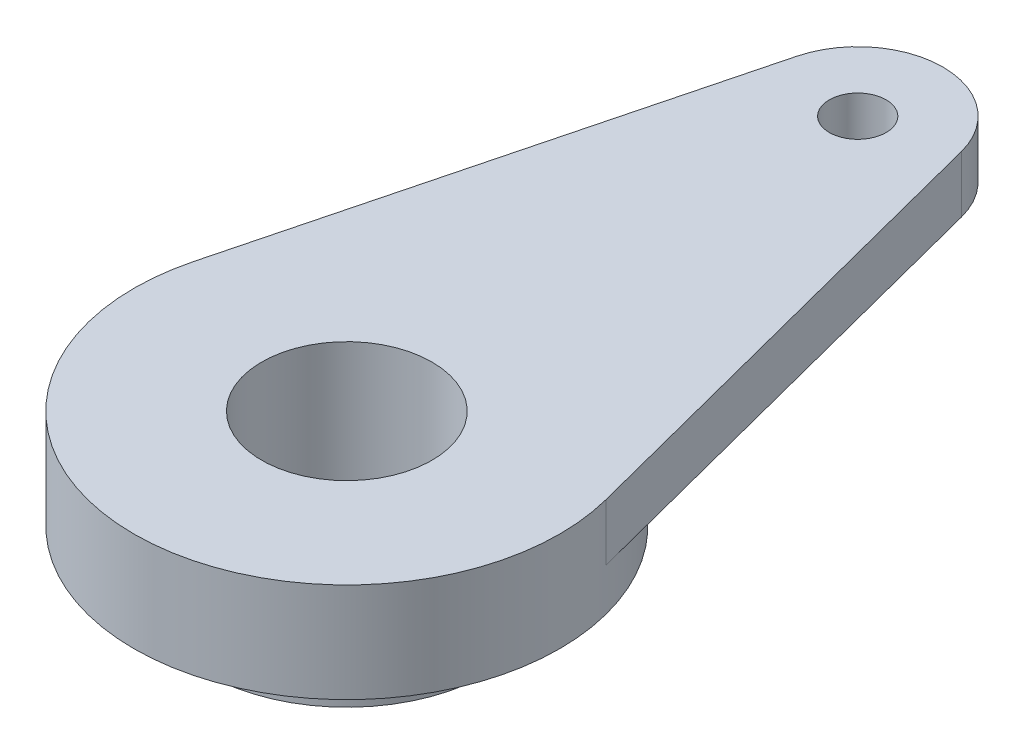
ISO-10303-21;
HEADER;
FILE_DESCRIPTION(('STEP AP214'),'2;1');
FILE_NAME('part.step','',(''),(''),'','','');
FILE_SCHEMA(('AUTOMOTIVE_DESIGN { 1 0 10303 214 1 1 1 1 }'));
ENDSEC;
DATA;
#1=APPLICATION_CONTEXT('core data for automotive mechanical design processes');
#2=APPLICATION_PROTOCOL_DEFINITION('international standard','automotive_design',2000,#1);
#3=PRODUCT_CONTEXT('',#1,'mechanical');
#4=PRODUCT('Part','Part','',(#3));
#5=PRODUCT_RELATED_PRODUCT_CATEGORY('part','',(#4));
#6=PRODUCT_DEFINITION_FORMATION('','',#4);
#7=PRODUCT_DEFINITION_CONTEXT('part definition',#1,'design');
#8=PRODUCT_DEFINITION('design','',#6,#7);
#9=PRODUCT_DEFINITION_SHAPE('','',#8);
#10=(LENGTH_UNIT() NAMED_UNIT(*) SI_UNIT(.MILLI.,.METRE.));
#11=(NAMED_UNIT(*) PLANE_ANGLE_UNIT() SI_UNIT($,.RADIAN.));
#12=(NAMED_UNIT(*) SI_UNIT($,.STERADIAN.) SOLID_ANGLE_UNIT());
#13=UNCERTAINTY_MEASURE_WITH_UNIT(LENGTH_MEASURE(1.E-05),#10,'distance_accuracy_value','');
#14=(GEOMETRIC_REPRESENTATION_CONTEXT(3) GLOBAL_UNCERTAINTY_ASSIGNED_CONTEXT((#13)) GLOBAL_UNIT_ASSIGNED_CONTEXT((#10,
#11,#12)) REPRESENTATION_CONTEXT('',''));
#15=CARTESIAN_POINT('',(0.,0.,0.));
#16=DIRECTION('',(0.,0.,1.));
#17=DIRECTION('',(1.,0.,0.));
#18=AXIS2_PLACEMENT_3D('',#15,#16,#17);
#19=CARTESIAN_POINT('',(0.,2.,0.));
#20=DIRECTION('',(0.,-1.,0.));
#21=DIRECTION('',(0.,0.,-1.));
#22=AXIS2_PLACEMENT_3D('',#19,#20,#21);
#23=CYLINDRICAL_SURFACE('',#22,5.);
#24=CARTESIAN_POINT('',(0.,2.,0.));
#25=DIRECTION('',(0.,1.,0.));
#26=DIRECTION('',(0.,0.,1.));
#27=AXIS2_PLACEMENT_3D('',#24,#25,#26);
#28=CIRCLE('',#27,5.);
#29=CARTESIAN_POINT('',(0.,2.,5.));
#30=VERTEX_POINT('',#29);
#31=EDGE_CURVE('E11',#30,#30,#28,.T.);
#32=ORIENTED_EDGE('',*,*,#31,.F.);
#33=EDGE_LOOP('',(#32));
#34=FACE_BOUND('',#33,.T.);
#35=CARTESIAN_POINT('',(0.,0.,0.));
#36=DIRECTION('',(0.,1.,0.));
#37=DIRECTION('',(0.,0.,1.));
#38=AXIS2_PLACEMENT_3D('',#35,#36,#37);
#39=CIRCLE('',#38,5.);
#40=CARTESIAN_POINT('',(0.,0.,5.));
#41=VERTEX_POINT('',#40);
#42=EDGE_CURVE('E37',#41,#41,#39,.T.);
#43=ORIENTED_EDGE('',*,*,#42,.T.);
#44=EDGE_LOOP('',(#43));
#45=FACE_BOUND('',#44,.T.);
#46=ADVANCED_FACE('F34',(#34,#45),#23,.T.);
#47=CARTESIAN_POINT('',(0.,0.,0.));
#48=DIRECTION('',(0.,1.,0.));
#49=DIRECTION('',(0.,0.,1.));
#50=AXIS2_PLACEMENT_3D('',#47,#48,#49);
#51=PLANE('',#50);
#52=CARTESIAN_POINT('',(0.,0.,0.));
#53=DIRECTION('',(0.,-1.,0.));
#54=DIRECTION('',(0.,0.,-1.));
#55=AXIS2_PLACEMENT_3D('',#52,#53,#54);
#56=CIRCLE('',#55,3.);
#57=CARTESIAN_POINT('',(0.,0.,-3.));
#58=VERTEX_POINT('',#57);
#59=EDGE_CURVE('E147',#58,#58,#56,.T.);
#60=ORIENTED_EDGE('',*,*,#59,.F.);
#61=EDGE_LOOP('',(#60));
#62=FACE_BOUND('',#61,.T.);
#63=ORIENTED_EDGE('',*,*,#42,.F.);
#64=EDGE_LOOP('',(#63));
#65=FACE_BOUND('',#64,.T.);
#66=ADVANCED_FACE('F129',(#62,#65),#51,.F.);
#67=CARTESIAN_POINT('',(0.,3.5,0.));
#68=DIRECTION('',(0.,-1.,0.));
#69=DIRECTION('',(0.,0.,-1.));
#70=AXIS2_PLACEMENT_3D('',#67,#68,#69);
#71=CYLINDRICAL_SURFACE('',#70,7.5);
#72=CARTESIAN_POINT('',(0.,3.5,0.));
#73=DIRECTION('',(0.,1.,0.));
#74=DIRECTION('',(0.,0.,1.));
#75=AXIS2_PLACEMENT_3D('',#72,#73,#74);
#76=CIRCLE('',#75,7.5);
#77=CARTESIAN_POINT('',(7.26184377413891,3.5,-1.87500000000001));
#78=VERTEX_POINT('',#77);
#79=CARTESIAN_POINT('',(-7.26184377413891,3.5,-1.875));
#80=VERTEX_POINT('',#79);
#81=EDGE_CURVE('E48',#78,#80,#76,.T.);
#82=ORIENTED_EDGE('',*,*,#81,.F.);
#83=DIRECTION('',(0.,-1.,0.));
#84=VECTOR('',#83,1.);
#85=CARTESIAN_POINT('',(7.26184377413891,5.5,-1.87500000000001));
#86=LINE('',#85,#84);
#87=CARTESIAN_POINT('',(7.26184377413891,5.5,-1.87500000000001));
#88=VERTEX_POINT('',#87);
#89=EDGE_CURVE('E95',#88,#78,#86,.T.);
#90=ORIENTED_EDGE('',*,*,#89,.F.);
#91=CARTESIAN_POINT('',(0.,5.5,0.));
#92=DIRECTION('',(0.,1.,0.));
#93=DIRECTION('',(0.,0.,1.));
#94=AXIS2_PLACEMENT_3D('',#91,#92,#93);
#95=CIRCLE('',#94,7.5);
#96=CARTESIAN_POINT('',(-7.26184377413891,5.5,-1.875));
#97=VERTEX_POINT('',#96);
#98=EDGE_CURVE('E83',#97,#88,#95,.T.);
#99=ORIENTED_EDGE('',*,*,#98,.F.);
#100=DIRECTION('',(0.,-1.,0.));
#101=VECTOR('',#100,1.);
#102=CARTESIAN_POINT('',(-7.26184377413891,5.5,-1.875));
#103=LINE('',#102,#101);
#104=EDGE_CURVE('E90',#97,#80,#103,.T.);
#105=ORIENTED_EDGE('',*,*,#104,.T.);
#106=EDGE_LOOP('',(#82,#90,#99,#105));
#107=FACE_BOUND('',#106,.T.);
#108=CARTESIAN_POINT('',(0.,2.,0.));
#109=DIRECTION('',(0.,1.,0.));
#110=DIRECTION('',(0.,0.,1.));
#111=AXIS2_PLACEMENT_3D('',#108,#109,#110);
#112=CIRCLE('',#111,7.5);
#113=CARTESIAN_POINT('',(0.,2.,7.5));
#114=VERTEX_POINT('',#113);
#115=EDGE_CURVE('E113',#114,#114,#112,.T.);
#116=ORIENTED_EDGE('',*,*,#115,.T.);
#117=EDGE_LOOP('',(#116));
#118=FACE_BOUND('',#117,.T.);
#119=ADVANCED_FACE('F97',(#107,#118),#71,.T.);
#120=CARTESIAN_POINT('',(0.,2.,0.));
#121=DIRECTION('',(0.,1.,0.));
#122=DIRECTION('',(0.,0.,1.));
#123=AXIS2_PLACEMENT_3D('',#120,#121,#122);
#124=PLANE('',#123);
#125=ORIENTED_EDGE('',*,*,#31,.T.);
#126=EDGE_LOOP('',(#125));
#127=FACE_BOUND('',#126,.T.);
#128=ORIENTED_EDGE('',*,*,#115,.F.);
#129=EDGE_LOOP('',(#128));
#130=FACE_BOUND('',#129,.T.);
#131=ADVANCED_FACE('F118',(#127,#130),#124,.F.);
#132=CARTESIAN_POINT('',(0.,3.5,-18.));
#133=DIRECTION('',(0.,1.,0.));
#134=DIRECTION('',(0.,0.,1.));
#135=AXIS2_PLACEMENT_3D('',#132,#133,#134);
#136=PLANE('',#135);
#137=CARTESIAN_POINT('',(0.,3.5,-18.));
#138=DIRECTION('',(0.,1.,0.));
#139=DIRECTION('',(0.,0.,1.));
#140=AXIS2_PLACEMENT_3D('',#137,#138,#139);
#141=CIRCLE('',#140,1.);
#142=CARTESIAN_POINT('',(0.,3.5,-17.));
#143=VERTEX_POINT('',#142);
#144=EDGE_CURVE('E152',#143,#143,#141,.T.);
#145=ORIENTED_EDGE('',*,*,#144,.T.);
#146=EDGE_LOOP('',(#145));
#147=FACE_BOUND('',#146,.T.);
#148=DIRECTION('',(-0.25,0.,-0.968245836551854));
#149=VECTOR('',#148,1.);
#150=CARTESIAN_POINT('',(2.90473750965556,3.5,-18.75));
#151=LINE('',#150,#149);
#152=CARTESIAN_POINT('',(2.90473750965556,3.5,-18.75));
#153=VERTEX_POINT('',#152);
#154=EDGE_CURVE('E71',#78,#153,#151,.T.);
#155=ORIENTED_EDGE('',*,*,#154,.F.);
#156=ORIENTED_EDGE('',*,*,#81,.T.);
#157=DIRECTION('',(-0.25,0.,0.968245836551854));
#158=VECTOR('',#157,1.);
#159=CARTESIAN_POINT('',(-2.90473750965556,3.5,-18.75));
#160=LINE('',#159,#158);
#161=CARTESIAN_POINT('',(-2.90473750965556,3.5,-18.75));
#162=VERTEX_POINT('',#161);
#163=EDGE_CURVE('E92',#162,#80,#160,.T.);
#164=ORIENTED_EDGE('',*,*,#163,.F.);
#165=CARTESIAN_POINT('',(0.,3.5,-18.));
#166=DIRECTION('',(0.,1.,0.));
#167=DIRECTION('',(0.,0.,1.));
#168=AXIS2_PLACEMENT_3D('',#165,#166,#167);
#169=CIRCLE('',#168,3.);
#170=EDGE_CURVE('E104',#153,#162,#169,.T.);
#171=ORIENTED_EDGE('',*,*,#170,.F.);
#172=EDGE_LOOP('',(#155,#156,#164,#171));
#173=FACE_BOUND('',#172,.T.);
#174=ADVANCED_FACE('F120',(#147,#173),#136,.F.);
#175=CARTESIAN_POINT('',(0.,5.5,-18.));
#176=DIRECTION('',(0.,1.,0.));
#177=DIRECTION('',(0.,0.,1.));
#178=AXIS2_PLACEMENT_3D('',#175,#176,#177);
#179=PLANE('',#178);
#180=CARTESIAN_POINT('',(0.,5.5,0.));
#181=DIRECTION('',(0.,-1.,0.));
#182=DIRECTION('',(0.,0.,-1.));
#183=AXIS2_PLACEMENT_3D('',#180,#181,#182);
#184=CIRCLE('',#183,3.);
#185=CARTESIAN_POINT('',(0.,5.5,-3.));
#186=VERTEX_POINT('',#185);
#187=EDGE_CURVE('E149',#186,#186,#184,.T.);
#188=ORIENTED_EDGE('',*,*,#187,.T.);
#189=EDGE_LOOP('',(#188));
#190=FACE_BOUND('',#189,.T.);
#191=CARTESIAN_POINT('',(0.,5.5,-18.));
#192=DIRECTION('',(0.,1.,0.));
#193=DIRECTION('',(0.,0.,1.));
#194=AXIS2_PLACEMENT_3D('',#191,#192,#193);
#195=CIRCLE('',#194,3.);
#196=CARTESIAN_POINT('',(2.90473750965556,5.5,-18.75));
#197=VERTEX_POINT('',#196);
#198=CARTESIAN_POINT('',(-2.90473750965556,5.5,-18.75));
#199=VERTEX_POINT('',#198);
#200=EDGE_CURVE('E86',#197,#199,#195,.T.);
#201=ORIENTED_EDGE('',*,*,#200,.T.);
#202=DIRECTION('',(-0.25,0.,0.968245836551854));
#203=VECTOR('',#202,1.);
#204=CARTESIAN_POINT('',(-2.90473750965556,5.5,-18.75));
#205=LINE('',#204,#203);
#206=EDGE_CURVE('E79',#199,#97,#205,.T.);
#207=ORIENTED_EDGE('',*,*,#206,.T.);
#208=ORIENTED_EDGE('',*,*,#98,.T.);
#209=DIRECTION('',(-0.25,0.,-0.968245836551854));
#210=VECTOR('',#209,1.);
#211=CARTESIAN_POINT('',(2.90473750965556,5.5,-18.75));
#212=LINE('',#211,#210);
#213=EDGE_CURVE('E57',#88,#197,#212,.T.);
#214=ORIENTED_EDGE('',*,*,#213,.T.);
#215=EDGE_LOOP('',(#201,#207,#208,#214));
#216=FACE_BOUND('',#215,.T.);
#217=CARTESIAN_POINT('',(0.,5.5,-18.));
#218=DIRECTION('',(0.,1.,0.));
#219=DIRECTION('',(0.,0.,1.));
#220=AXIS2_PLACEMENT_3D('',#217,#218,#219);
#221=CIRCLE('',#220,1.);
#222=CARTESIAN_POINT('',(0.,5.5,-17.));
#223=VERTEX_POINT('',#222);
#224=EDGE_CURVE('E107',#223,#223,#221,.T.);
#225=ORIENTED_EDGE('',*,*,#224,.F.);
#226=EDGE_LOOP('',(#225));
#227=FACE_BOUND('',#226,.T.);
#228=ADVANCED_FACE('F80',(#190,#216,#227),#179,.T.);
#229=CARTESIAN_POINT('',(0.,5.5,-18.));
#230=DIRECTION('',(0.,-1.,0.));
#231=DIRECTION('',(0.,0.,-1.));
#232=AXIS2_PLACEMENT_3D('',#229,#230,#231);
#233=CYLINDRICAL_SURFACE('',#232,3.);
#234=ORIENTED_EDGE('',*,*,#170,.T.);
#235=DIRECTION('',(0.,-1.,0.));
#236=VECTOR('',#235,1.);
#237=CARTESIAN_POINT('',(-2.90473750965556,5.5,-18.75));
#238=LINE('',#237,#236);
#239=EDGE_CURVE('E94',#199,#162,#238,.T.);
#240=ORIENTED_EDGE('',*,*,#239,.F.);
#241=ORIENTED_EDGE('',*,*,#200,.F.);
#242=DIRECTION('',(0.,-1.,0.));
#243=VECTOR('',#242,1.);
#244=CARTESIAN_POINT('',(2.90473750965556,5.5,-18.75));
#245=LINE('',#244,#243);
#246=EDGE_CURVE('E100',#197,#153,#245,.T.);
#247=ORIENTED_EDGE('',*,*,#246,.T.);
#248=EDGE_LOOP('',(#234,#240,#241,#247));
#249=FACE_BOUND('',#248,.T.);
#250=ADVANCED_FACE('F175',(#249),#233,.T.);
#251=CARTESIAN_POINT('',(-2.90473750965556,5.5,-18.75));
#252=DIRECTION('',(0.968245836551854,0.,0.25));
#253=DIRECTION('',(0.25,0.,-0.968245836551854));
#254=AXIS2_PLACEMENT_3D('',#251,#252,#253);
#255=PLANE('',#254);
#256=ORIENTED_EDGE('',*,*,#163,.T.);
#257=ORIENTED_EDGE('',*,*,#104,.F.);
#258=ORIENTED_EDGE('',*,*,#206,.F.);
#259=ORIENTED_EDGE('',*,*,#239,.T.);
#260=EDGE_LOOP('',(#256,#257,#258,#259));
#261=FACE_BOUND('',#260,.T.);
#262=ADVANCED_FACE('F91',(#261),#255,.F.);
#263=CARTESIAN_POINT('',(2.90473750965556,5.5,-18.75));
#264=DIRECTION('',(-0.968245836551854,0.,0.25));
#265=DIRECTION('',(0.25,0.,0.968245836551854));
#266=AXIS2_PLACEMENT_3D('',#263,#264,#265);
#267=PLANE('',#266);
#268=ORIENTED_EDGE('',*,*,#154,.T.);
#269=ORIENTED_EDGE('',*,*,#246,.F.);
#270=ORIENTED_EDGE('',*,*,#213,.F.);
#271=ORIENTED_EDGE('',*,*,#89,.T.);
#272=EDGE_LOOP('',(#268,#269,#270,#271));
#273=FACE_BOUND('',#272,.T.);
#274=ADVANCED_FACE('F163',(#273),#267,.F.);
#275=CARTESIAN_POINT('',(0.,5.5,-18.));
#276=DIRECTION('',(0.,-1.,0.));
#277=DIRECTION('',(0.,0.,-1.));
#278=AXIS2_PLACEMENT_3D('',#275,#276,#277);
#279=CYLINDRICAL_SURFACE('',#278,1.);
#280=ORIENTED_EDGE('',*,*,#224,.T.);
#281=EDGE_LOOP('',(#280));
#282=FACE_BOUND('',#281,.T.);
#283=ORIENTED_EDGE('',*,*,#144,.F.);
#284=EDGE_LOOP('',(#283));
#285=FACE_BOUND('',#284,.T.);
#286=ADVANCED_FACE('F160',(#282,#285),#279,.F.);
#287=CARTESIAN_POINT('',(0.,5.5,0.));
#288=DIRECTION('',(0.,-1.,0.));
#289=DIRECTION('',(0.,0.,-1.));
#290=AXIS2_PLACEMENT_3D('',#287,#288,#289);
#291=CYLINDRICAL_SURFACE('',#290,3.);
#292=ORIENTED_EDGE('',*,*,#187,.F.);
#293=EDGE_LOOP('',(#292));
#294=FACE_BOUND('',#293,.T.);
#295=ORIENTED_EDGE('',*,*,#59,.T.);
#296=EDGE_LOOP('',(#295));
#297=FACE_BOUND('',#296,.T.);
#298=ADVANCED_FACE('F162',(#294,#297),#291,.F.);
#299=CLOSED_SHELL('',(#46,#66,#119,#131,#174,#228,#250,#262,#274,#286,#298));
#300=MANIFOLD_SOLID_BREP('B2',#299);
#301=ADVANCED_BREP_SHAPE_REPRESENTATION('',(#18,#300),#14);
#302=SHAPE_DEFINITION_REPRESENTATION(#9,#301);
ENDSEC;
END-ISO-10303-21;
